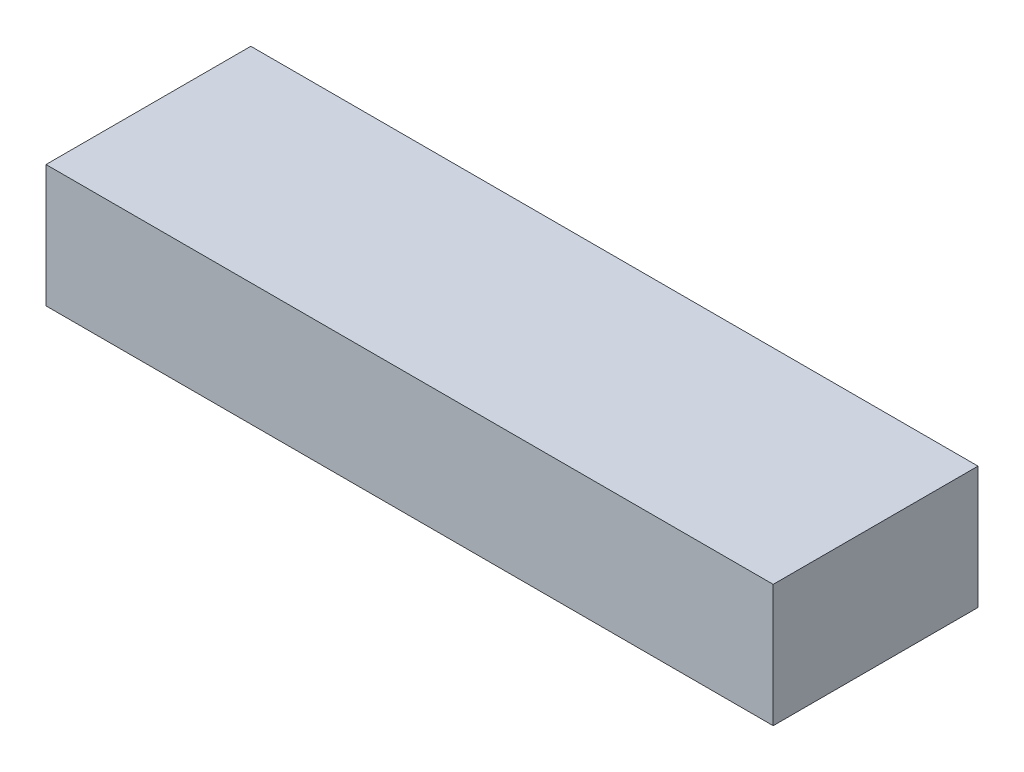
ISO-10303-21;
HEADER;
FILE_DESCRIPTION(('STEP AP214'),'2;1');
FILE_NAME('part.step','',(''),(''),'','','');
FILE_SCHEMA(('AUTOMOTIVE_DESIGN { 1 0 10303 214 1 1 1 1 }'));
ENDSEC;
DATA;
#1=APPLICATION_CONTEXT('core data for automotive mechanical design processes');
#2=APPLICATION_PROTOCOL_DEFINITION('international standard','automotive_design',2000,#1);
#3=PRODUCT_CONTEXT('',#1,'mechanical');
#4=PRODUCT('Part','Part','',(#3));
#5=PRODUCT_RELATED_PRODUCT_CATEGORY('part','',(#4));
#6=PRODUCT_DEFINITION_FORMATION('','',#4);
#7=PRODUCT_DEFINITION_CONTEXT('part definition',#1,'design');
#8=PRODUCT_DEFINITION('design','',#6,#7);
#9=PRODUCT_DEFINITION_SHAPE('','',#8);
#10=(LENGTH_UNIT() NAMED_UNIT(*) SI_UNIT(.MILLI.,.METRE.));
#11=(NAMED_UNIT(*) PLANE_ANGLE_UNIT() SI_UNIT($,.RADIAN.));
#12=(NAMED_UNIT(*) SI_UNIT($,.STERADIAN.) SOLID_ANGLE_UNIT());
#13=UNCERTAINTY_MEASURE_WITH_UNIT(LENGTH_MEASURE(1.E-05),#10,'distance_accuracy_value','');
#14=(GEOMETRIC_REPRESENTATION_CONTEXT(3) GLOBAL_UNCERTAINTY_ASSIGNED_CONTEXT((#13)) GLOBAL_UNIT_ASSIGNED_CONTEXT((#10,
#11,#12)) REPRESENTATION_CONTEXT('',''));
#15=CARTESIAN_POINT('',(0.,0.,0.));
#16=DIRECTION('',(0.,0.,1.));
#17=DIRECTION('',(1.,0.,0.));
#18=AXIS2_PLACEMENT_3D('',#15,#16,#17);
#19=CARTESIAN_POINT('',(-62.9906815018225,10.,-38.2499524830269));
#20=DIRECTION('',(1.,0.,0.));
#21=DIRECTION('',(0.,0.,-1.));
#22=AXIS2_PLACEMENT_3D('',#19,#20,#21);
#23=PLANE('',#22);
#24=DIRECTION('',(0.,0.,1.));
#25=VECTOR('',#24,1.);
#26=CARTESIAN_POINT('',(-62.9906815018225,0.,-38.2499524830269));
#27=LINE('',#26,#25);
#28=CARTESIAN_POINT('',(-62.9906815018225,0.,-38.2499524830269));
#29=VERTEX_POINT('',#28);
#30=CARTESIAN_POINT('',(-62.9906815018225,0.,-21.5228416063547));
#31=VERTEX_POINT('',#30);
#32=EDGE_CURVE('E100',#29,#31,#27,.T.);
#33=ORIENTED_EDGE('',*,*,#32,.T.);
#34=DIRECTION('',(0.,-1.,0.));
#35=VECTOR('',#34,1.);
#36=CARTESIAN_POINT('',(-62.9906815018225,10.,-21.5228416063547));
#37=LINE('',#36,#35);
#38=CARTESIAN_POINT('',(-62.9906815018225,10.,-21.5228416063547));
#39=VERTEX_POINT('',#38);
#40=EDGE_CURVE('E11',#39,#31,#37,.T.);
#41=ORIENTED_EDGE('',*,*,#40,.F.);
#42=DIRECTION('',(0.,0.,1.));
#43=VECTOR('',#42,1.);
#44=CARTESIAN_POINT('',(-62.9906815018225,10.,-38.2499524830269));
#45=LINE('',#44,#43);
#46=CARTESIAN_POINT('',(-62.9906815018225,10.,-38.2499524830269));
#47=VERTEX_POINT('',#46);
#48=EDGE_CURVE('E88',#47,#39,#45,.T.);
#49=ORIENTED_EDGE('',*,*,#48,.F.);
#50=DIRECTION('',(0.,-1.,0.));
#51=VECTOR('',#50,1.);
#52=CARTESIAN_POINT('',(-62.9906815018225,10.,-38.2499524830269));
#53=LINE('',#52,#51);
#54=EDGE_CURVE('E96',#47,#29,#53,.T.);
#55=ORIENTED_EDGE('',*,*,#54,.T.);
#56=EDGE_LOOP('',(#33,#41,#49,#55));
#57=FACE_BOUND('',#56,.T.);
#58=ADVANCED_FACE('F37',(#57),#23,.F.);
#59=CARTESIAN_POINT('',(-62.9906815018225,10.,-21.5228416063547));
#60=DIRECTION('',(0.,0.,-1.));
#61=DIRECTION('',(-1.,0.,0.));
#62=AXIS2_PLACEMENT_3D('',#59,#60,#61);
#63=PLANE('',#62);
#64=DIRECTION('',(1.,0.,0.));
#65=VECTOR('',#64,1.);
#66=CARTESIAN_POINT('',(-62.9906815018225,0.,-21.5228416063547));
#67=LINE('',#66,#65);
#68=CARTESIAN_POINT('',(-3.60143166321475,0.,-21.5228416063547));
#69=VERTEX_POINT('',#68);
#70=EDGE_CURVE('E92',#31,#69,#67,.T.);
#71=ORIENTED_EDGE('',*,*,#70,.T.);
#72=DIRECTION('',(0.,-1.,0.));
#73=VECTOR('',#72,1.);
#74=CARTESIAN_POINT('',(-3.60143166321475,10.,-21.5228416063547));
#75=LINE('',#74,#73);
#76=CARTESIAN_POINT('',(-3.60143166321475,10.,-21.5228416063547));
#77=VERTEX_POINT('',#76);
#78=EDGE_CURVE('E45',#77,#69,#75,.T.);
#79=ORIENTED_EDGE('',*,*,#78,.F.);
#80=DIRECTION('',(1.,0.,0.));
#81=VECTOR('',#80,1.);
#82=CARTESIAN_POINT('',(-62.9906815018225,10.,-21.5228416063547));
#83=LINE('',#82,#81);
#84=EDGE_CURVE('E83',#39,#77,#83,.T.);
#85=ORIENTED_EDGE('',*,*,#84,.F.);
#86=ORIENTED_EDGE('',*,*,#40,.T.);
#87=EDGE_LOOP('',(#71,#79,#85,#86));
#88=FACE_BOUND('',#87,.T.);
#89=ADVANCED_FACE('F91',(#88),#63,.F.);
#90=CARTESIAN_POINT('',(-3.60143166321475,10.,-38.2499524830269));
#91=DIRECTION('',(-1.,0.,0.));
#92=DIRECTION('',(0.,0.,1.));
#93=AXIS2_PLACEMENT_3D('',#90,#91,#92);
#94=PLANE('',#93);
#95=DIRECTION('',(0.,0.,-1.));
#96=VECTOR('',#95,1.);
#97=CARTESIAN_POINT('',(-3.60143166321475,0.,-38.2499524830269));
#98=LINE('',#97,#96);
#99=CARTESIAN_POINT('',(-3.60143166321475,0.,-38.2499524830269));
#100=VERTEX_POINT('',#99);
#101=EDGE_CURVE('E70',#69,#100,#98,.T.);
#102=ORIENTED_EDGE('',*,*,#101,.T.);
#103=DIRECTION('',(0.,-1.,0.));
#104=VECTOR('',#103,1.);
#105=CARTESIAN_POINT('',(-3.60143166321475,10.,-38.2499524830269));
#106=LINE('',#105,#104);
#107=CARTESIAN_POINT('',(-3.60143166321475,10.,-38.2499524830269));
#108=VERTEX_POINT('',#107);
#109=EDGE_CURVE('E93',#108,#100,#106,.T.);
#110=ORIENTED_EDGE('',*,*,#109,.F.);
#111=DIRECTION('',(0.,0.,-1.));
#112=VECTOR('',#111,1.);
#113=CARTESIAN_POINT('',(-3.60143166321475,10.,-38.2499524830269));
#114=LINE('',#113,#112);
#115=EDGE_CURVE('E86',#77,#108,#114,.T.);
#116=ORIENTED_EDGE('',*,*,#115,.F.);
#117=ORIENTED_EDGE('',*,*,#78,.T.);
#118=EDGE_LOOP('',(#102,#110,#116,#117));
#119=FACE_BOUND('',#118,.T.);
#120=ADVANCED_FACE('F94',(#119),#94,.F.);
#121=CARTESIAN_POINT('',(-62.9906815018225,10.,-38.2499524830269));
#122=DIRECTION('',(0.,0.,1.));
#123=DIRECTION('',(1.,0.,0.));
#124=AXIS2_PLACEMENT_3D('',#121,#122,#123);
#125=PLANE('',#124);
#126=DIRECTION('',(-1.,0.,0.));
#127=VECTOR('',#126,1.);
#128=CARTESIAN_POINT('',(-62.9906815018225,0.,-38.2499524830269));
#129=LINE('',#128,#127);
#130=EDGE_CURVE('E76',#100,#29,#129,.T.);
#131=ORIENTED_EDGE('',*,*,#130,.T.);
#132=ORIENTED_EDGE('',*,*,#54,.F.);
#133=DIRECTION('',(-1.,0.,0.));
#134=VECTOR('',#133,1.);
#135=CARTESIAN_POINT('',(-62.9906815018225,10.,-38.2499524830269));
#136=LINE('',#135,#134);
#137=EDGE_CURVE('E53',#108,#47,#136,.T.);
#138=ORIENTED_EDGE('',*,*,#137,.F.);
#139=ORIENTED_EDGE('',*,*,#109,.T.);
#140=EDGE_LOOP('',(#131,#132,#138,#139));
#141=FACE_BOUND('',#140,.T.);
#142=ADVANCED_FACE('F107',(#141),#125,.F.);
#143=CARTESIAN_POINT('',(0.,10.,0.));
#144=DIRECTION('',(0.,1.,0.));
#145=DIRECTION('',(0.,0.,1.));
#146=AXIS2_PLACEMENT_3D('',#143,#144,#145);
#147=PLANE('',#146);
#148=ORIENTED_EDGE('',*,*,#48,.T.);
#149=ORIENTED_EDGE('',*,*,#84,.T.);
#150=ORIENTED_EDGE('',*,*,#115,.T.);
#151=ORIENTED_EDGE('',*,*,#137,.T.);
#152=EDGE_LOOP('',(#148,#149,#150,#151));
#153=FACE_BOUND('',#152,.T.);
#154=ADVANCED_FACE('F84',(#153),#147,.T.);
#155=CARTESIAN_POINT('',(0.,0.,0.));
#156=DIRECTION('',(0.,1.,0.));
#157=DIRECTION('',(0.,0.,1.));
#158=AXIS2_PLACEMENT_3D('',#155,#156,#157);
#159=PLANE('',#158);
#160=ORIENTED_EDGE('',*,*,#32,.F.);
#161=ORIENTED_EDGE('',*,*,#130,.F.);
#162=ORIENTED_EDGE('',*,*,#101,.F.);
#163=ORIENTED_EDGE('',*,*,#70,.F.);
#164=EDGE_LOOP('',(#160,#161,#162,#163));
#165=FACE_BOUND('',#164,.T.);
#166=ADVANCED_FACE('F110',(#165),#159,.F.);
#167=CLOSED_SHELL('',(#58,#89,#120,#142,#154,#166));
#168=MANIFOLD_SOLID_BREP('B2',#167);
#169=ADVANCED_BREP_SHAPE_REPRESENTATION('',(#18,#168),#14);
#170=SHAPE_DEFINITION_REPRESENTATION(#9,#169);
ENDSEC;
END-ISO-10303-21;
